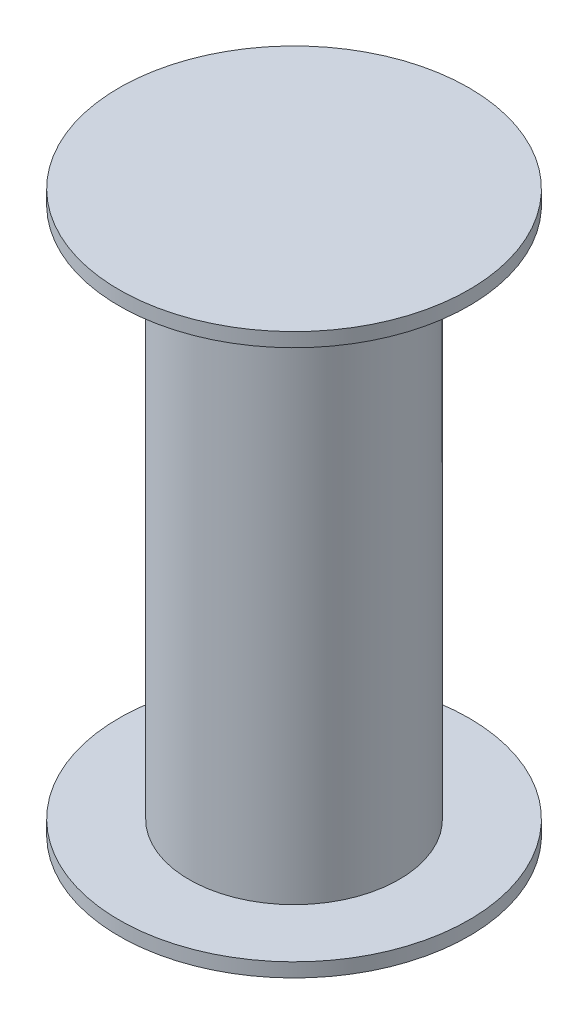
ISO-10303-21;
HEADER;
FILE_DESCRIPTION(('STEP AP214'),'2;1');
FILE_NAME('part.step','',(''),(''),'','','');
FILE_SCHEMA(('AUTOMOTIVE_DESIGN { 1 0 10303 214 1 1 1 1 }'));
ENDSEC;
DATA;
#1=APPLICATION_CONTEXT('core data for automotive mechanical design processes');
#2=APPLICATION_PROTOCOL_DEFINITION('international standard','automotive_design',2000,#1);
#3=PRODUCT_CONTEXT('',#1,'mechanical');
#4=PRODUCT('Part','Part','',(#3));
#5=PRODUCT_RELATED_PRODUCT_CATEGORY('part','',(#4));
#6=PRODUCT_DEFINITION_FORMATION('','',#4);
#7=PRODUCT_DEFINITION_CONTEXT('part definition',#1,'design');
#8=PRODUCT_DEFINITION('design','',#6,#7);
#9=PRODUCT_DEFINITION_SHAPE('','',#8);
#10=(LENGTH_UNIT() NAMED_UNIT(*) SI_UNIT(.MILLI.,.METRE.));
#11=(NAMED_UNIT(*) PLANE_ANGLE_UNIT() SI_UNIT($,.RADIAN.));
#12=(NAMED_UNIT(*) SI_UNIT($,.STERADIAN.) SOLID_ANGLE_UNIT());
#13=UNCERTAINTY_MEASURE_WITH_UNIT(LENGTH_MEASURE(1.E-05),#10,'distance_accuracy_value','');
#14=(GEOMETRIC_REPRESENTATION_CONTEXT(3) GLOBAL_UNCERTAINTY_ASSIGNED_CONTEXT((#13)) GLOBAL_UNIT_ASSIGNED_CONTEXT((#10,
#11,#12)) REPRESENTATION_CONTEXT('',''));
#15=CARTESIAN_POINT('',(0.,0.,0.));
#16=DIRECTION('',(0.,0.,1.));
#17=DIRECTION('',(1.,0.,0.));
#18=AXIS2_PLACEMENT_3D('',#15,#16,#17);
#19=CARTESIAN_POINT('',(0.,32.054347826087,0.));
#20=DIRECTION('',(0.,1.,0.));
#21=DIRECTION('',(0.,0.,1.));
#22=AXIS2_PLACEMENT_3D('',#19,#20,#21);
#23=PLANE('',#22);
#24=CARTESIAN_POINT('',(0.,32.054347826087,0.));
#25=DIRECTION('',(0.,-1.,0.));
#26=DIRECTION('',(0.,0.,-1.));
#27=AXIS2_PLACEMENT_3D('',#24,#25,#26);
#28=CIRCLE('',#27,12.5);
#29=CARTESIAN_POINT('',(0.,32.054347826087,-12.5));
#30=VERTEX_POINT('',#29);
#31=EDGE_CURVE('E10',#30,#30,#28,.T.);
#32=ORIENTED_EDGE('',*,*,#31,.F.);
#33=EDGE_LOOP('',(#32));
#34=FACE_BOUND('',#33,.T.);
#35=ADVANCED_FACE('F39',(#34),#23,.T.);
#36=CARTESIAN_POINT('',(0.,-27.0147302899266,0.));
#37=DIRECTION('',(0.,-1.,0.));
#38=DIRECTION('',(0.,0.,-1.));
#39=AXIS2_PLACEMENT_3D('',#36,#37,#38);
#40=CYLINDRICAL_SURFACE('',#39,12.5);
#41=CARTESIAN_POINT('',(0.,31.054347826087,0.));
#42=DIRECTION('',(0.,-1.,0.));
#43=DIRECTION('',(0.,0.,-1.));
#44=AXIS2_PLACEMENT_3D('',#41,#42,#43);
#45=CIRCLE('',#44,12.5);
#46=CARTESIAN_POINT('',(0.,31.054347826087,-12.5));
#47=VERTEX_POINT('',#46);
#48=EDGE_CURVE('E45',#47,#47,#45,.T.);
#49=ORIENTED_EDGE('',*,*,#48,.F.);
#50=EDGE_LOOP('',(#49));
#51=FACE_BOUND('',#50,.T.);
#52=ORIENTED_EDGE('',*,*,#31,.T.);
#53=EDGE_LOOP('',(#52));
#54=FACE_BOUND('',#53,.T.);
#55=ADVANCED_FACE('F81',(#51,#54),#40,.T.);
#56=CARTESIAN_POINT('',(0.,31.054347826087,0.));
#57=DIRECTION('',(0.,1.,0.));
#58=DIRECTION('',(0.,0.,1.));
#59=AXIS2_PLACEMENT_3D('',#56,#57,#58);
#60=PLANE('',#59);
#61=CARTESIAN_POINT('',(0.,31.054347826087,0.));
#62=DIRECTION('',(0.,-1.,0.));
#63=DIRECTION('',(0.,0.,-1.));
#64=AXIS2_PLACEMENT_3D('',#61,#62,#63);
#65=CIRCLE('',#64,7.5);
#66=CARTESIAN_POINT('',(0.,31.054347826087,-7.5));
#67=VERTEX_POINT('',#66);
#68=EDGE_CURVE('E49',#67,#67,#65,.T.);
#69=ORIENTED_EDGE('',*,*,#68,.F.);
#70=EDGE_LOOP('',(#69));
#71=FACE_BOUND('',#70,.T.);
#72=ORIENTED_EDGE('',*,*,#48,.T.);
#73=EDGE_LOOP('',(#72));
#74=FACE_BOUND('',#73,.T.);
#75=ADVANCED_FACE('F86',(#71,#74),#60,.F.);
#76=CARTESIAN_POINT('',(0.,-27.0147302899266,0.));
#77=DIRECTION('',(0.,-1.,0.));
#78=DIRECTION('',(0.,0.,-1.));
#79=AXIS2_PLACEMENT_3D('',#76,#77,#78);
#80=CYLINDRICAL_SURFACE('',#79,7.5);
#81=CARTESIAN_POINT('',(0.,-6.94565217391303,0.));
#82=DIRECTION('',(0.,-1.,0.));
#83=DIRECTION('',(0.,0.,-1.));
#84=AXIS2_PLACEMENT_3D('',#81,#82,#83);
#85=CIRCLE('',#84,7.50000000000001);
#86=CARTESIAN_POINT('',(0.,-6.94565217391303,-7.50000000000001));
#87=VERTEX_POINT('',#86);
#88=EDGE_CURVE('E53',#87,#87,#85,.T.);
#89=ORIENTED_EDGE('',*,*,#88,.F.);
#90=EDGE_LOOP('',(#89));
#91=FACE_BOUND('',#90,.T.);
#92=ORIENTED_EDGE('',*,*,#68,.T.);
#93=EDGE_LOOP('',(#92));
#94=FACE_BOUND('',#93,.T.);
#95=ADVANCED_FACE('F77',(#91,#94),#80,.T.);
#96=CARTESIAN_POINT('',(0.,-6.94565217391304,0.));
#97=DIRECTION('',(0.,1.,0.));
#98=DIRECTION('',(0.,0.,1.));
#99=AXIS2_PLACEMENT_3D('',#96,#97,#98);
#100=PLANE('',#99);
#101=ORIENTED_EDGE('',*,*,#88,.T.);
#102=EDGE_LOOP('',(#101));
#103=FACE_BOUND('',#102,.T.);
#104=CARTESIAN_POINT('',(0.,-6.94565217391304,0.));
#105=DIRECTION('',(0.,-1.,0.));
#106=DIRECTION('',(0.,0.,-1.));
#107=AXIS2_PLACEMENT_3D('',#104,#105,#106);
#108=CIRCLE('',#107,12.5);
#109=CARTESIAN_POINT('',(0.,-6.94565217391304,-12.5));
#110=VERTEX_POINT('',#109);
#111=EDGE_CURVE('E58',#110,#110,#108,.T.);
#112=ORIENTED_EDGE('',*,*,#111,.F.);
#113=EDGE_LOOP('',(#112));
#114=FACE_BOUND('',#113,.T.);
#115=ADVANCED_FACE('F69',(#103,#114),#100,.T.);
#116=CARTESIAN_POINT('',(0.,-27.0147302899266,0.));
#117=DIRECTION('',(0.,-1.,0.));
#118=DIRECTION('',(0.,0.,-1.));
#119=AXIS2_PLACEMENT_3D('',#116,#117,#118);
#120=CYLINDRICAL_SURFACE('',#119,12.5);
#121=ORIENTED_EDGE('',*,*,#111,.T.);
#122=EDGE_LOOP('',(#121));
#123=FACE_BOUND('',#122,.T.);
#124=CARTESIAN_POINT('',(0.,-7.94565217391304,0.));
#125=DIRECTION('',(0.,-1.,0.));
#126=DIRECTION('',(0.,0.,-1.));
#127=AXIS2_PLACEMENT_3D('',#124,#125,#126);
#128=CIRCLE('',#127,12.5);
#129=CARTESIAN_POINT('',(0.,-7.94565217391304,-12.5));
#130=VERTEX_POINT('',#129);
#131=EDGE_CURVE('E61',#130,#130,#128,.T.);
#132=ORIENTED_EDGE('',*,*,#131,.F.);
#133=EDGE_LOOP('',(#132));
#134=FACE_BOUND('',#133,.T.);
#135=ADVANCED_FACE('F67',(#123,#134),#120,.T.);
#136=CARTESIAN_POINT('',(0.,-7.94565217391304,0.));
#137=DIRECTION('',(0.,1.,0.));
#138=DIRECTION('',(0.,0.,1.));
#139=AXIS2_PLACEMENT_3D('',#136,#137,#138);
#140=PLANE('',#139);
#141=ORIENTED_EDGE('',*,*,#131,.T.);
#142=EDGE_LOOP('',(#141));
#143=FACE_BOUND('',#142,.T.);
#144=ADVANCED_FACE('F65',(#143),#140,.F.);
#145=CLOSED_SHELL('',(#35,#55,#75,#95,#115,#135,#144));
#146=MANIFOLD_SOLID_BREP('B2',#145);
#147=ADVANCED_BREP_SHAPE_REPRESENTATION('',(#18,#146),#14);
#148=SHAPE_DEFINITION_REPRESENTATION(#9,#147);
ENDSEC;
END-ISO-10303-21;
